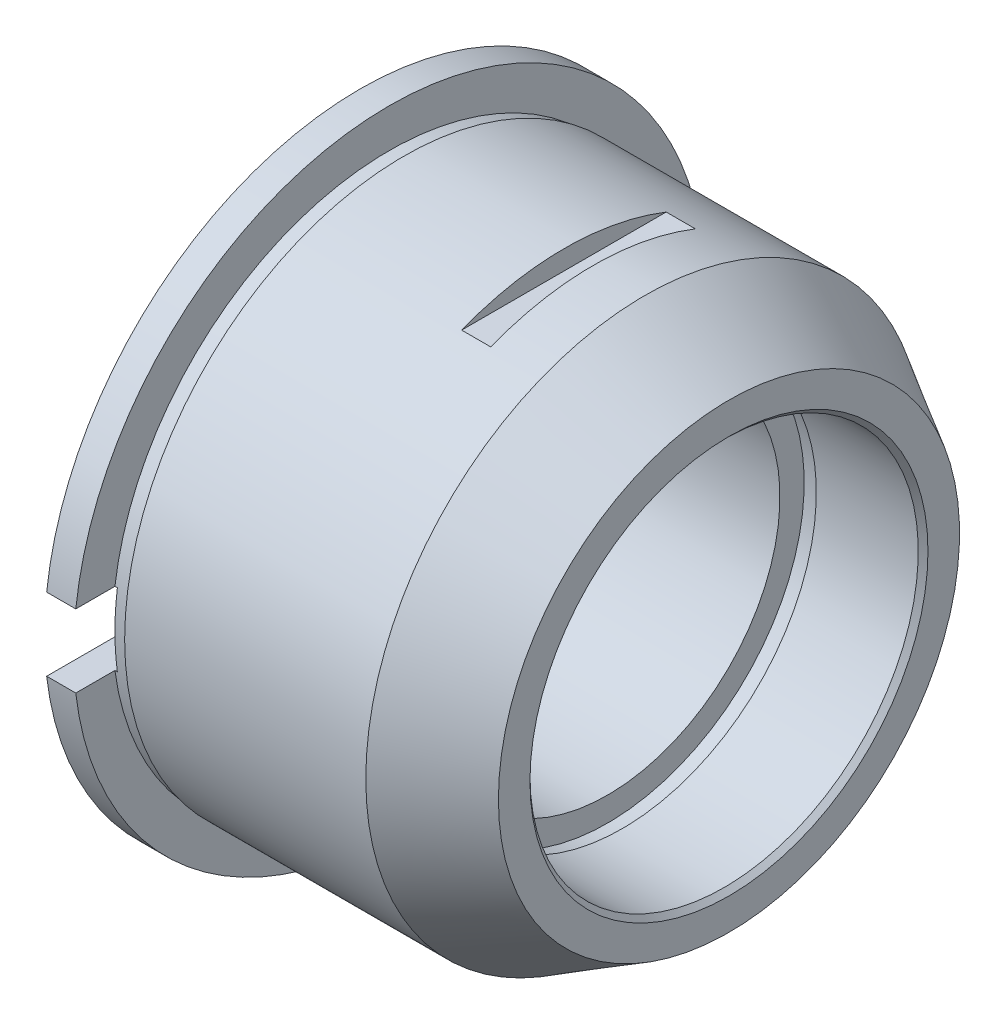
ISO-10303-21;
HEADER;
FILE_DESCRIPTION(('STEP AP214'),'2;1');
FILE_NAME('part.step','',(''),(''),'','','');
FILE_SCHEMA(('AUTOMOTIVE_DESIGN { 1 0 10303 214 1 1 1 1 }'));
ENDSEC;
DATA;
#1=APPLICATION_CONTEXT('core data for automotive mechanical design processes');
#2=APPLICATION_PROTOCOL_DEFINITION('international standard','automotive_design',2000,#1);
#3=PRODUCT_CONTEXT('',#1,'mechanical');
#4=PRODUCT('Part','Part','',(#3));
#5=PRODUCT_RELATED_PRODUCT_CATEGORY('part','',(#4));
#6=PRODUCT_DEFINITION_FORMATION('','',#4);
#7=PRODUCT_DEFINITION_CONTEXT('part definition',#1,'design');
#8=PRODUCT_DEFINITION('design','',#6,#7);
#9=PRODUCT_DEFINITION_SHAPE('','',#8);
#10=(LENGTH_UNIT() NAMED_UNIT(*) SI_UNIT(.MILLI.,.METRE.));
#11=(NAMED_UNIT(*) PLANE_ANGLE_UNIT() SI_UNIT($,.RADIAN.));
#12=(NAMED_UNIT(*) SI_UNIT($,.STERADIAN.) SOLID_ANGLE_UNIT());
#13=UNCERTAINTY_MEASURE_WITH_UNIT(LENGTH_MEASURE(1.E-05),#10,'distance_accuracy_value','');
#14=(GEOMETRIC_REPRESENTATION_CONTEXT(3) GLOBAL_UNCERTAINTY_ASSIGNED_CONTEXT((#13)) GLOBAL_UNIT_ASSIGNED_CONTEXT((#10,
#11,#12)) REPRESENTATION_CONTEXT('',''));
#15=CARTESIAN_POINT('',(0.,0.,0.));
#16=DIRECTION('',(0.,0.,1.));
#17=DIRECTION('',(1.,0.,0.));
#18=AXIS2_PLACEMENT_3D('',#15,#16,#17);
#19=CARTESIAN_POINT('',(0.,65.,0.));
#20=DIRECTION('',(1.,0.,0.));
#21=DIRECTION('',(0.,0.,-1.));
#22=AXIS2_PLACEMENT_3D('',#19,#20,#21);
#23=PLANE('',#22);
#24=CARTESIAN_POINT('',(0.,0.,0.));
#25=DIRECTION('',(-1.,0.,0.));
#26=DIRECTION('',(0.,0.,1.));
#27=AXIS2_PLACEMENT_3D('',#24,#25,#26);
#28=CIRCLE('',#27,65.);
#29=CARTESIAN_POINT('',(0.,7.5,64.5658578507248));
#30=VERTEX_POINT('',#29);
#31=CARTESIAN_POINT('',(0.,7.5,-64.5658578507248));
#32=VERTEX_POINT('',#31);
#33=EDGE_CURVE('E244',#30,#32,#28,.T.);
#34=ORIENTED_EDGE('',*,*,#33,.T.);
#35=DIRECTION('',(0.,0.,1.));
#36=VECTOR('',#35,1.);
#37=CARTESIAN_POINT('',(0.,7.5,-65.));
#38=LINE('',#37,#36);
#39=CARTESIAN_POINT('',(0.,7.5,-38.2720524665192));
#40=VERTEX_POINT('',#39);
#41=EDGE_CURVE('E189',#32,#40,#38,.T.);
#42=ORIENTED_EDGE('',*,*,#41,.T.);
#43=CARTESIAN_POINT('',(0.,0.,0.));
#44=DIRECTION('',(-1.,0.,0.));
#45=DIRECTION('',(0.,0.,1.));
#46=AXIS2_PLACEMENT_3D('',#43,#44,#45);
#47=CIRCLE('',#46,39.);
#48=CARTESIAN_POINT('',(0.,7.5,38.2720524665192));
#49=VERTEX_POINT('',#48);
#50=EDGE_CURVE('E291',#49,#40,#47,.T.);
#51=ORIENTED_EDGE('',*,*,#50,.F.);
#52=EDGE_CURVE('E325',#49,#30,#38,.T.);
#53=ORIENTED_EDGE('',*,*,#52,.T.);
#54=EDGE_LOOP('',(#34,#42,#51,#53));
#55=FACE_BOUND('',#54,.T.);
#56=ADVANCED_FACE('F34',(#55),#23,.F.);
#57=CARTESIAN_POINT('',(0.,0.,0.));
#58=DIRECTION('',(-1.,0.,0.));
#59=DIRECTION('',(0.,0.,1.));
#60=AXIS2_PLACEMENT_3D('',#57,#58,#59);
#61=CYLINDRICAL_SURFACE('',#60,39.);
#62=ORIENTED_EDGE('',*,*,#50,.T.);
#63=DIRECTION('',(-1.,0.,0.));
#64=VECTOR('',#63,1.);
#65=CARTESIAN_POINT('',(0.,7.5,-38.2720524665192));
#66=LINE('',#65,#64);
#67=CARTESIAN_POINT('',(6.,7.5,-38.2720524665192));
#68=VERTEX_POINT('',#67);
#69=EDGE_CURVE('E229',#40,#68,#66,.F.);
#70=ORIENTED_EDGE('',*,*,#69,.T.);
#71=CARTESIAN_POINT('',(6.,0.,0.));
#72=DIRECTION('',(-1.,0.,0.));
#73=DIRECTION('',(0.,0.,1.));
#74=AXIS2_PLACEMENT_3D('',#71,#72,#73);
#75=CIRCLE('',#74,39.);
#76=CARTESIAN_POINT('',(6.,7.5,38.2720524665192));
#77=VERTEX_POINT('',#76);
#78=EDGE_CURVE('E287',#77,#68,#75,.T.);
#79=ORIENTED_EDGE('',*,*,#78,.F.);
#80=DIRECTION('',(-1.,0.,0.));
#81=VECTOR('',#80,1.);
#82=CARTESIAN_POINT('',(0.,7.5,38.2720524665192));
#83=LINE('',#82,#81);
#84=EDGE_CURVE('E222',#77,#49,#83,.T.);
#85=ORIENTED_EDGE('',*,*,#84,.T.);
#86=EDGE_LOOP('',(#62,#70,#79,#85));
#87=FACE_BOUND('',#86,.T.);
#88=ADVANCED_FACE('F362',(#87),#61,.F.);
#89=CARTESIAN_POINT('',(6.,39.,0.));
#90=DIRECTION('',(1.,0.,0.));
#91=DIRECTION('',(0.,0.,-1.));
#92=AXIS2_PLACEMENT_3D('',#89,#90,#91);
#93=PLANE('',#92);
#94=ORIENTED_EDGE('',*,*,#78,.T.);
#95=DIRECTION('',(0.,0.,1.));
#96=VECTOR('',#95,1.);
#97=CARTESIAN_POINT('',(6.,7.5,0.));
#98=LINE('',#97,#96);
#99=CARTESIAN_POINT('',(6.,7.5,-34.6987031457949));
#100=VERTEX_POINT('',#99);
#101=EDGE_CURVE('E223',#68,#100,#98,.T.);
#102=ORIENTED_EDGE('',*,*,#101,.T.);
#103=CARTESIAN_POINT('',(6.,0.,0.));
#104=DIRECTION('',(-1.,0.,0.));
#105=DIRECTION('',(0.,0.,1.));
#106=AXIS2_PLACEMENT_3D('',#103,#104,#105);
#107=CIRCLE('',#106,35.5);
#108=CARTESIAN_POINT('',(6.,7.5,34.6987031457949));
#109=VERTEX_POINT('',#108);
#110=EDGE_CURVE('E283',#109,#100,#107,.T.);
#111=ORIENTED_EDGE('',*,*,#110,.F.);
#112=EDGE_CURVE('E219',#109,#77,#98,.T.);
#113=ORIENTED_EDGE('',*,*,#112,.T.);
#114=EDGE_LOOP('',(#94,#102,#111,#113));
#115=FACE_BOUND('',#114,.T.);
#116=ADVANCED_FACE('F359',(#115),#93,.F.);
#117=CARTESIAN_POINT('',(6.,57.,0.));
#118=DIRECTION('',(-1.,0.,0.));
#119=DIRECTION('',(0.,0.,1.));
#120=AXIS2_PLACEMENT_3D('',#117,#118,#119);
#121=PLANE('',#120);
#122=CARTESIAN_POINT('',(6.,0.,0.));
#123=DIRECTION('',(-1.,0.,0.));
#124=DIRECTION('',(0.,0.,1.));
#125=AXIS2_PLACEMENT_3D('',#122,#123,#124);
#126=CIRCLE('',#125,65.);
#127=CARTESIAN_POINT('',(6.,7.5,64.5658578507248));
#128=VERTEX_POINT('',#127);
#129=CARTESIAN_POINT('',(6.,7.5,-64.5658578507248));
#130=VERTEX_POINT('',#129);
#131=EDGE_CURVE('E248',#128,#130,#126,.T.);
#132=ORIENTED_EDGE('',*,*,#131,.F.);
#133=DIRECTION('',(0.,0.,-1.));
#134=VECTOR('',#133,1.);
#135=CARTESIAN_POINT('',(6.,7.5,0.));
#136=LINE('',#135,#134);
#137=CARTESIAN_POINT('',(6.,7.5,56.5044246055121));
#138=VERTEX_POINT('',#137);
#139=EDGE_CURVE('E207',#128,#138,#136,.T.);
#140=ORIENTED_EDGE('',*,*,#139,.T.);
#141=CARTESIAN_POINT('',(6.,0.,0.));
#142=DIRECTION('',(-1.,0.,0.));
#143=DIRECTION('',(0.,0.,1.));
#144=AXIS2_PLACEMENT_3D('',#141,#142,#143);
#145=CIRCLE('',#144,57.);
#146=CARTESIAN_POINT('',(6.,7.5,-56.5044246055121));
#147=VERTEX_POINT('',#146);
#148=EDGE_CURVE('E249',#138,#147,#145,.T.);
#149=ORIENTED_EDGE('',*,*,#148,.T.);
#150=EDGE_CURVE('E211',#147,#130,#136,.T.);
#151=ORIENTED_EDGE('',*,*,#150,.T.);
#152=EDGE_LOOP('',(#132,#140,#149,#151));
#153=FACE_BOUND('',#152,.T.);
#154=ADVANCED_FACE('F349',(#153),#121,.F.);
#155=CARTESIAN_POINT('',(0.,0.,0.));
#156=DIRECTION('',(-1.,0.,0.));
#157=DIRECTION('',(0.,0.,1.));
#158=AXIS2_PLACEMENT_3D('',#155,#156,#157);
#159=CYLINDRICAL_SURFACE('',#158,65.);
#160=CARTESIAN_POINT('',(6.,-7.5,-64.5658578507248));
#161=VERTEX_POINT('',#160);
#162=CARTESIAN_POINT('',(6.,-7.5,64.5658578507248));
#163=VERTEX_POINT('',#162);
#164=EDGE_CURVE('E245',#161,#163,#126,.T.);
#165=ORIENTED_EDGE('',*,*,#164,.T.);
#166=DIRECTION('',(-1.,0.,0.));
#167=VECTOR('',#166,1.);
#168=CARTESIAN_POINT('',(0.,-7.5,64.5658578507248));
#169=LINE('',#168,#167);
#170=CARTESIAN_POINT('',(0.,-7.5,64.5658578507248));
#171=VERTEX_POINT('',#170);
#172=EDGE_CURVE('E308',#163,#171,#169,.T.);
#173=ORIENTED_EDGE('',*,*,#172,.T.);
#174=CARTESIAN_POINT('',(0.,-7.5,-64.5658578507248));
#175=VERTEX_POINT('',#174);
#176=EDGE_CURVE('E238',#175,#171,#28,.T.);
#177=ORIENTED_EDGE('',*,*,#176,.F.);
#178=DIRECTION('',(-1.,0.,0.));
#179=VECTOR('',#178,1.);
#180=CARTESIAN_POINT('',(0.,-7.5,-64.5658578507248));
#181=LINE('',#180,#179);
#182=EDGE_CURVE('E306',#175,#161,#181,.F.);
#183=ORIENTED_EDGE('',*,*,#182,.T.);
#184=EDGE_LOOP('',(#165,#173,#177,#183));
#185=FACE_BOUND('',#184,.T.);
#186=ADVANCED_FACE('F342',(#185),#159,.T.);
#187=ORIENTED_EDGE('',*,*,#176,.T.);
#188=DIRECTION('',(0.,0.,1.));
#189=VECTOR('',#188,1.);
#190=CARTESIAN_POINT('',(0.,-7.5,-65.));
#191=LINE('',#190,#189);
#192=CARTESIAN_POINT('',(0.,-7.5,38.2720524665192));
#193=VERTEX_POINT('',#192);
#194=EDGE_CURVE('E57',#193,#171,#191,.T.);
#195=ORIENTED_EDGE('',*,*,#194,.F.);
#196=CARTESIAN_POINT('',(0.,-7.5,-38.2720524665192));
#197=VERTEX_POINT('',#196);
#198=EDGE_CURVE('E290',#197,#193,#47,.T.);
#199=ORIENTED_EDGE('',*,*,#198,.F.);
#200=EDGE_CURVE('E331',#175,#197,#191,.T.);
#201=ORIENTED_EDGE('',*,*,#200,.F.);
#202=EDGE_LOOP('',(#187,#195,#199,#201));
#203=FACE_BOUND('',#202,.T.);
#204=ADVANCED_FACE('F36',(#203),#23,.F.);
#205=ORIENTED_EDGE('',*,*,#198,.T.);
#206=DIRECTION('',(-1.,0.,0.));
#207=VECTOR('',#206,1.);
#208=CARTESIAN_POINT('',(0.,-7.5,38.2720524665192));
#209=LINE('',#208,#207);
#210=CARTESIAN_POINT('',(6.,-7.5,38.2720524665192));
#211=VERTEX_POINT('',#210);
#212=EDGE_CURVE('E204',#193,#211,#209,.F.);
#213=ORIENTED_EDGE('',*,*,#212,.T.);
#214=CARTESIAN_POINT('',(6.,-7.5,-38.2720524665192));
#215=VERTEX_POINT('',#214);
#216=EDGE_CURVE('E286',#215,#211,#75,.T.);
#217=ORIENTED_EDGE('',*,*,#216,.F.);
#218=DIRECTION('',(-1.,0.,0.));
#219=VECTOR('',#218,1.);
#220=CARTESIAN_POINT('',(0.,-7.5,-38.2720524665192));
#221=LINE('',#220,#219);
#222=EDGE_CURVE('E197',#215,#197,#221,.T.);
#223=ORIENTED_EDGE('',*,*,#222,.T.);
#224=EDGE_LOOP('',(#205,#213,#217,#223));
#225=FACE_BOUND('',#224,.T.);
#226=ADVANCED_FACE('F339',(#225),#61,.F.);
#227=ORIENTED_EDGE('',*,*,#216,.T.);
#228=DIRECTION('',(0.,0.,-1.));
#229=VECTOR('',#228,1.);
#230=CARTESIAN_POINT('',(6.,-7.5,0.));
#231=LINE('',#230,#229);
#232=CARTESIAN_POINT('',(6.,-7.5,34.6987031457949));
#233=VERTEX_POINT('',#232);
#234=EDGE_CURVE('E198',#211,#233,#231,.T.);
#235=ORIENTED_EDGE('',*,*,#234,.T.);
#236=CARTESIAN_POINT('',(6.,-7.5,-34.6987031457949));
#237=VERTEX_POINT('',#236);
#238=EDGE_CURVE('E282',#237,#233,#107,.T.);
#239=ORIENTED_EDGE('',*,*,#238,.F.);
#240=EDGE_CURVE('E194',#237,#215,#231,.T.);
#241=ORIENTED_EDGE('',*,*,#240,.T.);
#242=EDGE_LOOP('',(#227,#235,#239,#241));
#243=FACE_BOUND('',#242,.T.);
#244=ADVANCED_FACE('F372',(#243),#93,.F.);
#245=CARTESIAN_POINT('',(0.,0.,0.));
#246=DIRECTION('',(-1.,0.,0.));
#247=DIRECTION('',(0.,0.,1.));
#248=AXIS2_PLACEMENT_3D('',#245,#246,#247);
#249=CYLINDRICAL_SURFACE('',#248,35.5);
#250=CARTESIAN_POINT('',(51.,0.,0.));
#251=DIRECTION('',(-1.,0.,0.));
#252=DIRECTION('',(0.,0.,1.));
#253=AXIS2_PLACEMENT_3D('',#250,#251,#252);
#254=CIRCLE('',#253,35.5);
#255=CARTESIAN_POINT('',(51.,0.,35.5));
#256=VERTEX_POINT('',#255);
#257=EDGE_CURVE('E279',#256,#256,#254,.T.);
#258=ORIENTED_EDGE('',*,*,#257,.F.);
#259=EDGE_LOOP('',(#258));
#260=FACE_BOUND('',#259,.T.);
#261=CARTESIAN_POINT('',(6.5,0.,0.));
#262=DIRECTION('',(1.,0.,0.));
#263=DIRECTION('',(0.,0.,-1.));
#264=AXIS2_PLACEMENT_3D('',#261,#262,#263);
#265=CIRCLE('',#264,35.5);
#266=CARTESIAN_POINT('',(6.5,-7.5,34.6987031457949));
#267=VERTEX_POINT('',#266);
#268=CARTESIAN_POINT('',(6.5,7.5,34.6987031457949));
#269=VERTEX_POINT('',#268);
#270=EDGE_CURVE('E234',#267,#269,#265,.F.);
#271=ORIENTED_EDGE('',*,*,#270,.T.);
#272=DIRECTION('',(-1.,0.,0.));
#273=VECTOR('',#272,1.);
#274=CARTESIAN_POINT('',(0.,7.5,34.6987031457949));
#275=LINE('',#274,#273);
#276=EDGE_CURVE('E216',#269,#109,#275,.T.);
#277=ORIENTED_EDGE('',*,*,#276,.T.);
#278=ORIENTED_EDGE('',*,*,#110,.T.);
#279=DIRECTION('',(-1.,0.,0.));
#280=VECTOR('',#279,1.);
#281=CARTESIAN_POINT('',(0.,7.5,-34.6987031457949));
#282=LINE('',#281,#280);
#283=CARTESIAN_POINT('',(6.5,7.5,-34.6987031457949));
#284=VERTEX_POINT('',#283);
#285=EDGE_CURVE('E226',#100,#284,#282,.F.);
#286=ORIENTED_EDGE('',*,*,#285,.T.);
#287=CARTESIAN_POINT('',(6.5,-7.5,-34.6987031457949));
#288=VERTEX_POINT('',#287);
#289=EDGE_CURVE('E232',#284,#288,#265,.F.);
#290=ORIENTED_EDGE('',*,*,#289,.T.);
#291=DIRECTION('',(-1.,0.,0.));
#292=VECTOR('',#291,1.);
#293=CARTESIAN_POINT('',(0.,-7.5,-34.6987031457949));
#294=LINE('',#293,#292);
#295=EDGE_CURVE('E173',#288,#237,#294,.T.);
#296=ORIENTED_EDGE('',*,*,#295,.T.);
#297=ORIENTED_EDGE('',*,*,#238,.T.);
#298=DIRECTION('',(-1.,0.,0.));
#299=VECTOR('',#298,1.);
#300=CARTESIAN_POINT('',(0.,-7.5,34.6987031457949));
#301=LINE('',#300,#299);
#302=EDGE_CURVE('E201',#233,#267,#301,.F.);
#303=ORIENTED_EDGE('',*,*,#302,.T.);
#304=EDGE_LOOP('',(#271,#277,#278,#286,#290,#296,#297,#303));
#305=FACE_BOUND('',#304,.T.);
#306=ADVANCED_FACE('F409',(#260,#305),#249,.F.);
#307=CARTESIAN_POINT('',(51.,35.5,0.));
#308=DIRECTION('',(-1.,0.,0.));
#309=DIRECTION('',(0.,0.,1.));
#310=AXIS2_PLACEMENT_3D('',#307,#308,#309);
#311=PLANE('',#310);
#312=CARTESIAN_POINT('',(51.,0.,0.));
#313=DIRECTION('',(-1.,0.,0.));
#314=DIRECTION('',(0.,0.,1.));
#315=AXIS2_PLACEMENT_3D('',#312,#313,#314);
#316=CIRCLE('',#315,40.5);
#317=CARTESIAN_POINT('',(51.,0.,40.5));
#318=VERTEX_POINT('',#317);
#319=EDGE_CURVE('E276',#318,#318,#316,.T.);
#320=ORIENTED_EDGE('',*,*,#319,.F.);
#321=EDGE_LOOP('',(#320));
#322=FACE_BOUND('',#321,.T.);
#323=ORIENTED_EDGE('',*,*,#257,.T.);
#324=EDGE_LOOP('',(#323));
#325=FACE_BOUND('',#324,.T.);
#326=ADVANCED_FACE('F421',(#322,#325),#311,.F.);
#327=CARTESIAN_POINT('',(0.,0.,0.));
#328=DIRECTION('',(-1.,0.,0.));
#329=DIRECTION('',(0.,0.,1.));
#330=AXIS2_PLACEMENT_3D('',#327,#328,#329);
#331=CYLINDRICAL_SURFACE('',#330,40.5);
#332=CARTESIAN_POINT('',(54.,0.,0.));
#333=DIRECTION('',(-1.,0.,0.));
#334=DIRECTION('',(0.,0.,1.));
#335=AXIS2_PLACEMENT_3D('',#332,#333,#334);
#336=CIRCLE('',#335,40.5);
#337=CARTESIAN_POINT('',(54.,0.,40.5));
#338=VERTEX_POINT('',#337);
#339=EDGE_CURVE('E273',#338,#338,#336,.T.);
#340=ORIENTED_EDGE('',*,*,#339,.F.);
#341=EDGE_LOOP('',(#340));
#342=FACE_BOUND('',#341,.T.);
#343=ORIENTED_EDGE('',*,*,#319,.T.);
#344=EDGE_LOOP('',(#343));
#345=FACE_BOUND('',#344,.T.);
#346=ADVANCED_FACE('F604',(#342,#345),#331,.F.);
#347=CARTESIAN_POINT('',(54.,40.5,0.));
#348=DIRECTION('',(1.,0.,0.));
#349=DIRECTION('',(0.,0.,-1.));
#350=AXIS2_PLACEMENT_3D('',#347,#348,#349);
#351=PLANE('',#350);
#352=CARTESIAN_POINT('',(54.,0.,0.));
#353=DIRECTION('',(-1.,0.,0.));
#354=DIRECTION('',(0.,0.,1.));
#355=AXIS2_PLACEMENT_3D('',#352,#353,#354);
#356=CIRCLE('',#355,40.);
#357=CARTESIAN_POINT('',(54.,0.,40.));
#358=VERTEX_POINT('',#357);
#359=EDGE_CURVE('E270',#358,#358,#356,.T.);
#360=ORIENTED_EDGE('',*,*,#359,.F.);
#361=EDGE_LOOP('',(#360));
#362=FACE_BOUND('',#361,.T.);
#363=ORIENTED_EDGE('',*,*,#339,.T.);
#364=EDGE_LOOP('',(#363));
#365=FACE_BOUND('',#364,.T.);
#366=ADVANCED_FACE('F594',(#362,#365),#351,.F.);
#367=CARTESIAN_POINT('',(0.,0.,0.));
#368=DIRECTION('',(-1.,0.,0.));
#369=DIRECTION('',(0.,0.,1.));
#370=AXIS2_PLACEMENT_3D('',#367,#368,#369);
#371=CYLINDRICAL_SURFACE('',#370,40.);
#372=CARTESIAN_POINT('',(75.,0.,0.));
#373=DIRECTION('',(-1.,0.,0.));
#374=DIRECTION('',(0.,0.,1.));
#375=AXIS2_PLACEMENT_3D('',#372,#373,#374);
#376=CIRCLE('',#375,40.);
#377=CARTESIAN_POINT('',(75.,0.,40.));
#378=VERTEX_POINT('',#377);
#379=EDGE_CURVE('E267',#378,#378,#376,.T.);
#380=ORIENTED_EDGE('',*,*,#379,.F.);
#381=EDGE_LOOP('',(#380));
#382=FACE_BOUND('',#381,.T.);
#383=ORIENTED_EDGE('',*,*,#359,.T.);
#384=EDGE_LOOP('',(#383));
#385=FACE_BOUND('',#384,.T.);
#386=ADVANCED_FACE('F584',(#382,#385),#371,.F.);
#387=CARTESIAN_POINT('',(75.,0.,0.));
#388=DIRECTION('',(1.,0.,0.));
#389=DIRECTION('',(0.,0.,-1.));
#390=AXIS2_PLACEMENT_3D('',#387,#388,#389);
#391=CONICAL_SURFACE('',#390,40.,0.785398163397445);
#392=CARTESIAN_POINT('',(76.,0.,0.));
#393=DIRECTION('',(-1.,0.,0.));
#394=DIRECTION('',(0.,0.,1.));
#395=AXIS2_PLACEMENT_3D('',#392,#393,#394);
#396=CIRCLE('',#395,41.);
#397=CARTESIAN_POINT('',(76.,0.,41.));
#398=VERTEX_POINT('',#397);
#399=EDGE_CURVE('E264',#398,#398,#396,.T.);
#400=ORIENTED_EDGE('',*,*,#399,.F.);
#401=EDGE_LOOP('',(#400));
#402=FACE_BOUND('',#401,.T.);
#403=ORIENTED_EDGE('',*,*,#379,.T.);
#404=EDGE_LOOP('',(#403));
#405=FACE_BOUND('',#404,.T.);
#406=ADVANCED_FACE('F574',(#402,#405),#391,.F.);
#407=CARTESIAN_POINT('',(76.,41.,0.));
#408=DIRECTION('',(-1.,0.,0.));
#409=DIRECTION('',(0.,0.,1.));
#410=AXIS2_PLACEMENT_3D('',#407,#408,#409);
#411=PLANE('',#410);
#412=CARTESIAN_POINT('',(76.,0.,0.));
#413=DIRECTION('',(-1.,0.,0.));
#414=DIRECTION('',(0.,0.,1.));
#415=AXIS2_PLACEMENT_3D('',#412,#413,#414);
#416=CIRCLE('',#415,47.5);
#417=CARTESIAN_POINT('',(76.,0.,47.5));
#418=VERTEX_POINT('',#417);
#419=EDGE_CURVE('E261',#418,#418,#416,.T.);
#420=ORIENTED_EDGE('',*,*,#419,.F.);
#421=EDGE_LOOP('',(#420));
#422=FACE_BOUND('',#421,.T.);
#423=ORIENTED_EDGE('',*,*,#399,.T.);
#424=EDGE_LOOP('',(#423));
#425=FACE_BOUND('',#424,.T.);
#426=ADVANCED_FACE('F564',(#422,#425),#411,.F.);
#427=CARTESIAN_POINT('',(76.,0.,0.));
#428=DIRECTION('',(-1.,0.,0.));
#429=DIRECTION('',(0.,0.,1.));
#430=AXIS2_PLACEMENT_3D('',#427,#428,#429);
#431=CONICAL_SURFACE('',#430,47.5,0.523598775598293);
#432=CARTESIAN_POINT('',(58.679491924311,0.,0.));
#433=DIRECTION('',(-1.,0.,0.));
#434=DIRECTION('',(0.,0.,1.));
#435=AXIS2_PLACEMENT_3D('',#432,#433,#434);
#436=CIRCLE('',#435,57.5);
#437=CARTESIAN_POINT('',(58.679491924311,0.,57.5));
#438=VERTEX_POINT('',#437);
#439=EDGE_CURVE('E258',#438,#438,#436,.T.);
#440=ORIENTED_EDGE('',*,*,#439,.F.);
#441=EDGE_LOOP('',(#440));
#442=FACE_BOUND('',#441,.T.);
#443=ORIENTED_EDGE('',*,*,#419,.T.);
#444=EDGE_LOOP('',(#443));
#445=FACE_BOUND('',#444,.T.);
#446=ADVANCED_FACE('F470',(#442,#445),#431,.T.);
#447=CARTESIAN_POINT('',(0.,0.,0.));
#448=DIRECTION('',(-1.,0.,0.));
#449=DIRECTION('',(0.,0.,1.));
#450=AXIS2_PLACEMENT_3D('',#447,#448,#449);
#451=CYLINDRICAL_SURFACE('',#450,57.5);
#452=DIRECTION('',(-1.,0.,0.));
#453=VECTOR('',#452,1.);
#454=CARTESIAN_POINT('',(0.,53.5,21.0713075057055));
#455=LINE('',#454,#453);
#456=CARTESIAN_POINT('',(48.,53.5,21.0713075057055));
#457=VERTEX_POINT('',#456);
#458=CARTESIAN_POINT('',(42.,53.5,21.0713075057055));
#459=VERTEX_POINT('',#458);
#460=EDGE_CURVE('E303',#457,#459,#455,.T.);
#461=ORIENTED_EDGE('',*,*,#460,.T.);
#462=CARTESIAN_POINT('',(42.,0.,0.));
#463=DIRECTION('',(-1.,0.,0.));
#464=DIRECTION('',(0.,0.,1.));
#465=AXIS2_PLACEMENT_3D('',#462,#463,#464);
#466=CIRCLE('',#465,57.5);
#467=CARTESIAN_POINT('',(42.,53.5,-21.0713075057055));
#468=VERTEX_POINT('',#467);
#469=EDGE_CURVE('E294',#459,#468,#466,.T.);
#470=ORIENTED_EDGE('',*,*,#469,.T.);
#471=DIRECTION('',(-1.,0.,0.));
#472=VECTOR('',#471,1.);
#473=CARTESIAN_POINT('',(0.,53.5,-21.0713075057055));
#474=LINE('',#473,#472);
#475=CARTESIAN_POINT('',(48.,53.5,-21.0713075057055));
#476=VERTEX_POINT('',#475);
#477=EDGE_CURVE('E297',#468,#476,#474,.F.);
#478=ORIENTED_EDGE('',*,*,#477,.T.);
#479=CARTESIAN_POINT('',(48.,0.,0.));
#480=DIRECTION('',(1.,0.,0.));
#481=DIRECTION('',(0.,0.,-1.));
#482=AXIS2_PLACEMENT_3D('',#479,#480,#481);
#483=CIRCLE('',#482,57.5);
#484=EDGE_CURVE('E300',#476,#457,#483,.T.);
#485=ORIENTED_EDGE('',*,*,#484,.T.);
#486=EDGE_LOOP('',(#461,#470,#478,#485));
#487=FACE_BOUND('',#486,.T.);
#488=CARTESIAN_POINT('',(9.,0.,0.));
#489=DIRECTION('',(-1.,0.,0.));
#490=DIRECTION('',(0.,0.,1.));
#491=AXIS2_PLACEMENT_3D('',#488,#489,#490);
#492=CIRCLE('',#491,57.5);
#493=CARTESIAN_POINT('',(9.,0.,57.5));
#494=VERTEX_POINT('',#493);
#495=EDGE_CURVE('E255',#494,#494,#492,.T.);
#496=ORIENTED_EDGE('',*,*,#495,.F.);
#497=EDGE_LOOP('',(#496));
#498=FACE_BOUND('',#497,.T.);
#499=ORIENTED_EDGE('',*,*,#439,.T.);
#500=EDGE_LOOP('',(#499));
#501=FACE_BOUND('',#500,.T.);
#502=ADVANCED_FACE('F465',(#487,#498,#501),#451,.T.);
#503=CARTESIAN_POINT('',(9.,57.5,0.));
#504=DIRECTION('',(1.,0.,0.));
#505=DIRECTION('',(0.,0.,-1.));
#506=AXIS2_PLACEMENT_3D('',#503,#504,#505);
#507=PLANE('',#506);
#508=CARTESIAN_POINT('',(9.,0.,0.));
#509=DIRECTION('',(-1.,0.,0.));
#510=DIRECTION('',(0.,0.,1.));
#511=AXIS2_PLACEMENT_3D('',#508,#509,#510);
#512=CIRCLE('',#511,57.);
#513=CARTESIAN_POINT('',(9.,0.,57.));
#514=VERTEX_POINT('',#513);
#515=EDGE_CURVE('E252',#514,#514,#512,.T.);
#516=ORIENTED_EDGE('',*,*,#515,.F.);
#517=EDGE_LOOP('',(#516));
#518=FACE_BOUND('',#517,.T.);
#519=ORIENTED_EDGE('',*,*,#495,.T.);
#520=EDGE_LOOP('',(#519));
#521=FACE_BOUND('',#520,.T.);
#522=ADVANCED_FACE('F356',(#518,#521),#507,.F.);
#523=CARTESIAN_POINT('',(0.,0.,0.));
#524=DIRECTION('',(-1.,0.,0.));
#525=DIRECTION('',(0.,0.,1.));
#526=AXIS2_PLACEMENT_3D('',#523,#524,#525);
#527=CYLINDRICAL_SURFACE('',#526,57.);
#528=ORIENTED_EDGE('',*,*,#148,.F.);
#529=DIRECTION('',(-1.,0.,0.));
#530=VECTOR('',#529,1.);
#531=CARTESIAN_POINT('',(0.,7.5,56.5044246055121));
#532=LINE('',#531,#530);
#533=CARTESIAN_POINT('',(6.5,7.5,56.5044246055121));
#534=VERTEX_POINT('',#533);
#535=EDGE_CURVE('E210',#138,#534,#532,.F.);
#536=ORIENTED_EDGE('',*,*,#535,.T.);
#537=CARTESIAN_POINT('',(6.5,0.,0.));
#538=DIRECTION('',(1.,0.,0.));
#539=DIRECTION('',(0.,0.,-1.));
#540=AXIS2_PLACEMENT_3D('',#537,#538,#539);
#541=CIRCLE('',#540,57.);
#542=CARTESIAN_POINT('',(6.5,-7.5,56.5044246055121));
#543=VERTEX_POINT('',#542);
#544=EDGE_CURVE('E11',#534,#543,#541,.T.);
#545=ORIENTED_EDGE('',*,*,#544,.T.);
#546=DIRECTION('',(-1.,0.,0.));
#547=VECTOR('',#546,1.);
#548=CARTESIAN_POINT('',(0.,-7.5,56.5044246055121));
#549=LINE('',#548,#547);
#550=CARTESIAN_POINT('',(6.,-7.5,56.5044246055121));
#551=VERTEX_POINT('',#550);
#552=EDGE_CURVE('E187',#543,#551,#549,.T.);
#553=ORIENTED_EDGE('',*,*,#552,.T.);
#554=CARTESIAN_POINT('',(6.,-7.5,-56.5044246055121));
#555=VERTEX_POINT('',#554);
#556=EDGE_CURVE('E183',#555,#551,#145,.T.);
#557=ORIENTED_EDGE('',*,*,#556,.F.);
#558=DIRECTION('',(-1.,0.,0.));
#559=VECTOR('',#558,1.);
#560=CARTESIAN_POINT('',(0.,-7.5,-56.5044246055121));
#561=LINE('',#560,#559);
#562=CARTESIAN_POINT('',(6.5,-7.5,-56.5044246055121));
#563=VERTEX_POINT('',#562);
#564=EDGE_CURVE('E171',#555,#563,#561,.F.);
#565=ORIENTED_EDGE('',*,*,#564,.T.);
#566=CARTESIAN_POINT('',(6.5,7.5,-56.5044246055121));
#567=VERTEX_POINT('',#566);
#568=EDGE_CURVE('E38',#563,#567,#541,.T.);
#569=ORIENTED_EDGE('',*,*,#568,.T.);
#570=DIRECTION('',(-1.,0.,0.));
#571=VECTOR('',#570,1.);
#572=CARTESIAN_POINT('',(0.,7.5,-56.5044246055121));
#573=LINE('',#572,#571);
#574=EDGE_CURVE('E214',#567,#147,#573,.T.);
#575=ORIENTED_EDGE('',*,*,#574,.T.);
#576=EDGE_LOOP('',(#528,#536,#545,#553,#557,#565,#569,#575));
#577=FACE_BOUND('',#576,.T.);
#578=ORIENTED_EDGE('',*,*,#515,.T.);
#579=EDGE_LOOP('',(#578));
#580=FACE_BOUND('',#579,.T.);
#581=ADVANCED_FACE('F179',(#577,#580),#527,.T.);
#582=ORIENTED_EDGE('',*,*,#164,.F.);
#583=DIRECTION('',(0.,0.,1.));
#584=VECTOR('',#583,1.);
#585=CARTESIAN_POINT('',(6.,-7.5,0.));
#586=LINE('',#585,#584);
#587=EDGE_CURVE('E49',#161,#555,#586,.T.);
#588=ORIENTED_EDGE('',*,*,#587,.T.);
#589=ORIENTED_EDGE('',*,*,#556,.T.);
#590=EDGE_CURVE('E184',#551,#163,#586,.T.);
#591=ORIENTED_EDGE('',*,*,#590,.T.);
#592=EDGE_LOOP('',(#582,#588,#589,#591));
#593=FACE_BOUND('',#592,.T.);
#594=ADVANCED_FACE('F346',(#593),#121,.F.);
#595=ORIENTED_EDGE('',*,*,#131,.T.);
#596=DIRECTION('',(-1.,0.,0.));
#597=VECTOR('',#596,1.);
#598=CARTESIAN_POINT('',(0.,7.5,-64.5658578507248));
#599=LINE('',#598,#597);
#600=EDGE_CURVE('E169',#130,#32,#599,.T.);
#601=ORIENTED_EDGE('',*,*,#600,.T.);
#602=ORIENTED_EDGE('',*,*,#33,.F.);
#603=DIRECTION('',(-1.,0.,0.));
#604=VECTOR('',#603,1.);
#605=CARTESIAN_POINT('',(0.,7.5,64.5658578507248));
#606=LINE('',#605,#604);
#607=EDGE_CURVE('E310',#30,#128,#606,.F.);
#608=ORIENTED_EDGE('',*,*,#607,.T.);
#609=EDGE_LOOP('',(#595,#601,#602,#608));
#610=FACE_BOUND('',#609,.T.);
#611=ADVANCED_FACE('F317',(#610),#159,.T.);
#612=CARTESIAN_POINT('',(48.,57.5,-65.));
#613=DIRECTION('',(1.,0.,0.));
#614=DIRECTION('',(0.,0.,-1.));
#615=AXIS2_PLACEMENT_3D('',#612,#613,#614);
#616=PLANE('',#615);
#617=DIRECTION('',(0.,0.,1.));
#618=VECTOR('',#617,1.);
#619=CARTESIAN_POINT('',(48.,53.5,-65.));
#620=LINE('',#619,#618);
#621=EDGE_CURVE('E235',#476,#457,#620,.T.);
#622=ORIENTED_EDGE('',*,*,#621,.T.);
#623=ORIENTED_EDGE('',*,*,#484,.F.);
#624=EDGE_LOOP('',(#622,#623));
#625=FACE_BOUND('',#624,.T.);
#626=ADVANCED_FACE('F354',(#625),#616,.F.);
#627=CARTESIAN_POINT('',(48.,53.5,-65.));
#628=DIRECTION('',(0.,-1.,0.));
#629=DIRECTION('',(0.,0.,-1.));
#630=AXIS2_PLACEMENT_3D('',#627,#628,#629);
#631=PLANE('',#630);
#632=ORIENTED_EDGE('',*,*,#621,.F.);
#633=ORIENTED_EDGE('',*,*,#477,.F.);
#634=DIRECTION('',(0.,0.,1.));
#635=VECTOR('',#634,1.);
#636=CARTESIAN_POINT('',(42.,53.5,-65.));
#637=LINE('',#636,#635);
#638=EDGE_CURVE('E239',#468,#459,#637,.T.);
#639=ORIENTED_EDGE('',*,*,#638,.T.);
#640=ORIENTED_EDGE('',*,*,#460,.F.);
#641=EDGE_LOOP('',(#632,#633,#639,#640));
#642=FACE_BOUND('',#641,.T.);
#643=ADVANCED_FACE('F378',(#642),#631,.F.);
#644=CARTESIAN_POINT('',(42.,57.5,-65.));
#645=DIRECTION('',(-1.,0.,0.));
#646=DIRECTION('',(0.,0.,1.));
#647=AXIS2_PLACEMENT_3D('',#644,#645,#646);
#648=PLANE('',#647);
#649=ORIENTED_EDGE('',*,*,#638,.F.);
#650=ORIENTED_EDGE('',*,*,#469,.F.);
#651=EDGE_LOOP('',(#649,#650));
#652=FACE_BOUND('',#651,.T.);
#653=ADVANCED_FACE('F380',(#652),#648,.F.);
#654=CARTESIAN_POINT('',(0.,-7.5,-65.));
#655=DIRECTION('',(0.,-1.,0.));
#656=DIRECTION('',(0.,0.,-1.));
#657=AXIS2_PLACEMENT_3D('',#654,#655,#656);
#658=PLANE('',#657);
#659=ORIENTED_EDGE('',*,*,#240,.F.);
#660=ORIENTED_EDGE('',*,*,#295,.F.);
#661=DIRECTION('',(0.,0.,1.));
#662=VECTOR('',#661,1.);
#663=CARTESIAN_POINT('',(6.5,-7.5,-65.));
#664=LINE('',#663,#662);
#665=EDGE_CURVE('E162',#563,#288,#664,.T.);
#666=ORIENTED_EDGE('',*,*,#665,.F.);
#667=ORIENTED_EDGE('',*,*,#564,.F.);
#668=ORIENTED_EDGE('',*,*,#587,.F.);
#669=ORIENTED_EDGE('',*,*,#182,.F.);
#670=ORIENTED_EDGE('',*,*,#200,.T.);
#671=ORIENTED_EDGE('',*,*,#222,.F.);
#672=EDGE_LOOP('',(#659,#660,#666,#667,#668,#669,#670,#671));
#673=FACE_BOUND('',#672,.T.);
#674=ADVANCED_FACE('F170',(#673),#658,.F.);
#675=CARTESIAN_POINT('',(0.,7.5,-65.));
#676=DIRECTION('',(0.,1.,0.));
#677=DIRECTION('',(0.,0.,1.));
#678=AXIS2_PLACEMENT_3D('',#675,#676,#677);
#679=PLANE('',#678);
#680=ORIENTED_EDGE('',*,*,#41,.F.);
#681=ORIENTED_EDGE('',*,*,#600,.F.);
#682=ORIENTED_EDGE('',*,*,#150,.F.);
#683=ORIENTED_EDGE('',*,*,#574,.F.);
#684=DIRECTION('',(0.,0.,1.));
#685=VECTOR('',#684,1.);
#686=CARTESIAN_POINT('',(6.5,7.5,-65.));
#687=LINE('',#686,#685);
#688=EDGE_CURVE('E165',#567,#284,#687,.T.);
#689=ORIENTED_EDGE('',*,*,#688,.T.);
#690=ORIENTED_EDGE('',*,*,#285,.F.);
#691=ORIENTED_EDGE('',*,*,#101,.F.);
#692=ORIENTED_EDGE('',*,*,#69,.F.);
#693=EDGE_LOOP('',(#680,#681,#682,#683,#689,#690,#691,#692));
#694=FACE_BOUND('',#693,.T.);
#695=ADVANCED_FACE('F394',(#694),#679,.F.);
#696=CARTESIAN_POINT('',(6.5,7.5,-65.));
#697=DIRECTION('',(1.,0.,0.));
#698=DIRECTION('',(0.,0.,-1.));
#699=AXIS2_PLACEMENT_3D('',#696,#697,#698);
#700=PLANE('',#699);
#701=ORIENTED_EDGE('',*,*,#688,.F.);
#702=ORIENTED_EDGE('',*,*,#568,.F.);
#703=ORIENTED_EDGE('',*,*,#665,.T.);
#704=ORIENTED_EDGE('',*,*,#289,.F.);
#705=EDGE_LOOP('',(#701,#702,#703,#704));
#706=FACE_BOUND('',#705,.T.);
#707=ADVANCED_FACE('F161',(#706),#700,.F.);
#708=EDGE_CURVE('E175',#267,#543,#664,.T.);
#709=ORIENTED_EDGE('',*,*,#708,.T.);
#710=ORIENTED_EDGE('',*,*,#544,.F.);
#711=EDGE_CURVE('E174',#269,#534,#687,.T.);
#712=ORIENTED_EDGE('',*,*,#711,.F.);
#713=ORIENTED_EDGE('',*,*,#270,.F.);
#714=EDGE_LOOP('',(#709,#710,#712,#713));
#715=FACE_BOUND('',#714,.T.);
#716=ADVANCED_FACE('F390',(#715),#700,.F.);
#717=ORIENTED_EDGE('',*,*,#112,.F.);
#718=ORIENTED_EDGE('',*,*,#276,.F.);
#719=ORIENTED_EDGE('',*,*,#711,.T.);
#720=ORIENTED_EDGE('',*,*,#535,.F.);
#721=ORIENTED_EDGE('',*,*,#139,.F.);
#722=ORIENTED_EDGE('',*,*,#607,.F.);
#723=ORIENTED_EDGE('',*,*,#52,.F.);
#724=ORIENTED_EDGE('',*,*,#84,.F.);
#725=EDGE_LOOP('',(#717,#718,#719,#720,#721,#722,#723,#724));
#726=FACE_BOUND('',#725,.T.);
#727=ADVANCED_FACE('F389',(#726),#679,.F.);
#728=ORIENTED_EDGE('',*,*,#194,.T.);
#729=ORIENTED_EDGE('',*,*,#172,.F.);
#730=ORIENTED_EDGE('',*,*,#590,.F.);
#731=ORIENTED_EDGE('',*,*,#552,.F.);
#732=ORIENTED_EDGE('',*,*,#708,.F.);
#733=ORIENTED_EDGE('',*,*,#302,.F.);
#734=ORIENTED_EDGE('',*,*,#234,.F.);
#735=ORIENTED_EDGE('',*,*,#212,.F.);
#736=EDGE_LOOP('',(#728,#729,#730,#731,#732,#733,#734,#735));
#737=FACE_BOUND('',#736,.T.);
#738=ADVANCED_FACE('F344',(#737),#658,.F.);
#739=CLOSED_SHELL('',(#56,#88,#116,#154,#186,#204,#226,#244,#306,#326,#346,#366,#386,#406,#426,
#446,#502,#522,#581,#594,#611,#626,#643,#653,#674,#695,#707,#716,#727,#738));
#740=MANIFOLD_SOLID_BREP('B2',#739);
#741=ADVANCED_BREP_SHAPE_REPRESENTATION('',(#18,#740),#14);
#742=SHAPE_DEFINITION_REPRESENTATION(#9,#741);
ENDSEC;
END-ISO-10303-21;
